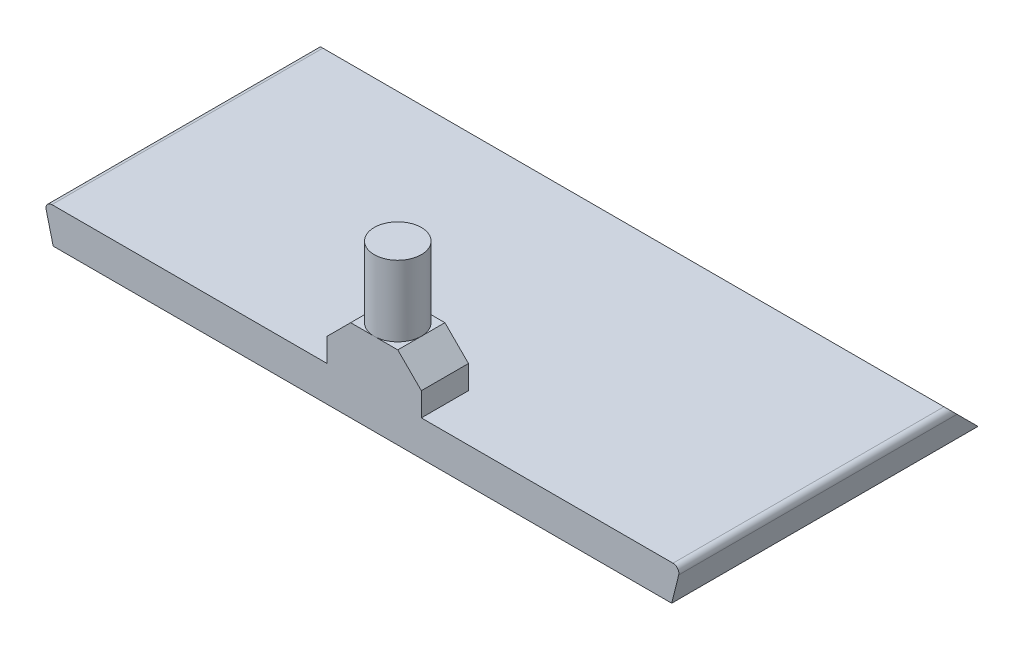
ISO-10303-21;
HEADER;
FILE_DESCRIPTION(('STEP AP214'),'2;1');
FILE_NAME('part.step','',(''),(''),'','','');
FILE_SCHEMA(('AUTOMOTIVE_DESIGN { 1 0 10303 214 1 1 1 1 }'));
ENDSEC;
DATA;
#1=APPLICATION_CONTEXT('core data for automotive mechanical design processes');
#2=APPLICATION_PROTOCOL_DEFINITION('international standard','automotive_design',2000,#1);
#3=PRODUCT_CONTEXT('',#1,'mechanical');
#4=PRODUCT('Part','Part','',(#3));
#5=PRODUCT_RELATED_PRODUCT_CATEGORY('part','',(#4));
#6=PRODUCT_DEFINITION_FORMATION('','',#4);
#7=PRODUCT_DEFINITION_CONTEXT('part definition',#1,'design');
#8=PRODUCT_DEFINITION('design','',#6,#7);
#9=PRODUCT_DEFINITION_SHAPE('','',#8);
#10=(LENGTH_UNIT() NAMED_UNIT(*) SI_UNIT(.MILLI.,.METRE.));
#11=(NAMED_UNIT(*) PLANE_ANGLE_UNIT() SI_UNIT($,.RADIAN.));
#12=(NAMED_UNIT(*) SI_UNIT($,.STERADIAN.) SOLID_ANGLE_UNIT());
#13=UNCERTAINTY_MEASURE_WITH_UNIT(LENGTH_MEASURE(1.E-05),#10,'distance_accuracy_value','');
#14=(GEOMETRIC_REPRESENTATION_CONTEXT(3) GLOBAL_UNCERTAINTY_ASSIGNED_CONTEXT((#13)) GLOBAL_UNIT_ASSIGNED_CONTEXT((#10,
#11,#12)) REPRESENTATION_CONTEXT('',''));
#15=CARTESIAN_POINT('',(0.,0.,0.));
#16=DIRECTION('',(0.,0.,1.));
#17=DIRECTION('',(1.,0.,0.));
#18=AXIS2_PLACEMENT_3D('',#15,#16,#17);
#19=CARTESIAN_POINT('',(0.,16.,0.));
#20=DIRECTION('',(0.,1.,0.));
#21=DIRECTION('',(-1.,0.,0.));
#22=AXIS2_PLACEMENT_3D('',#19,#20,#21);
#23=PLANE('',#22);
#24=DIRECTION('',(-1.,0.,0.));
#25=VECTOR('',#24,1.);
#26=CARTESIAN_POINT('',(0.,16.,33.5));
#27=LINE('',#26,#25);
#28=CARTESIAN_POINT('',(0.500000000000027,16.,33.5));
#29=VERTEX_POINT('',#28);
#30=CARTESIAN_POINT('',(-0.499999999999972,16.,33.5));
#31=VERTEX_POINT('',#30);
#32=EDGE_CURVE('E188',#29,#31,#27,.T.);
#33=ORIENTED_EDGE('',*,*,#32,.T.);
#34=DIRECTION('',(0.,0.,1.));
#35=VECTOR('',#34,1.);
#36=CARTESIAN_POINT('',(-0.499999999999972,16.,35.5));
#37=LINE('',#36,#35);
#38=CARTESIAN_POINT('',(-0.499999999999972,16.,34.5));
#39=VERTEX_POINT('',#38);
#40=EDGE_CURVE('E231',#31,#39,#37,.T.);
#41=ORIENTED_EDGE('',*,*,#40,.T.);
#42=CARTESIAN_POINT('',(0.500000000000027,16.,34.5));
#43=DIRECTION('',(0.,1.,0.));
#44=DIRECTION('',(-1.,0.,0.));
#45=AXIS2_PLACEMENT_3D('',#42,#43,#44);
#46=CIRCLE('',#45,1.);
#47=EDGE_CURVE('E185',#29,#39,#46,.T.);
#48=ORIENTED_EDGE('',*,*,#47,.F.);
#49=EDGE_LOOP('',(#33,#41,#48));
#50=FACE_BOUND('',#49,.T.);
#51=ADVANCED_FACE('F39',(#50),#23,.T.);
#52=CARTESIAN_POINT('',(0.,16.,0.));
#53=DIRECTION('',(0.,1.,0.));
#54=DIRECTION('',(-1.,0.,0.));
#55=AXIS2_PLACEMENT_3D('',#52,#53,#54);
#56=PLANE('',#55);
#57=DIRECTION('',(-1.,0.,0.));
#58=VECTOR('',#57,1.);
#59=CARTESIAN_POINT('',(0.,16.,35.5));
#60=LINE('',#59,#58);
#61=CARTESIAN_POINT('',(1.50000000000002,16.,35.5));
#62=VERTEX_POINT('',#61);
#63=CARTESIAN_POINT('',(0.500000000000027,16.,35.5));
#64=VERTEX_POINT('',#63);
#65=EDGE_CURVE('E172',#62,#64,#60,.T.);
#66=ORIENTED_EDGE('',*,*,#65,.F.);
#67=DIRECTION('',(0.,0.,-1.));
#68=VECTOR('',#67,1.);
#69=CARTESIAN_POINT('',(1.50000000000003,16.,0.));
#70=LINE('',#69,#68);
#71=CARTESIAN_POINT('',(1.50000000000002,16.,34.5));
#72=VERTEX_POINT('',#71);
#73=EDGE_CURVE('E223',#62,#72,#70,.T.);
#74=ORIENTED_EDGE('',*,*,#73,.T.);
#75=CARTESIAN_POINT('',(0.500000000000027,16.,34.5));
#76=DIRECTION('',(0.,1.,0.));
#77=DIRECTION('',(-1.,0.,0.));
#78=AXIS2_PLACEMENT_3D('',#75,#76,#77);
#79=CIRCLE('',#78,1.);
#80=EDGE_CURVE('E182',#64,#72,#79,.T.);
#81=ORIENTED_EDGE('',*,*,#80,.F.);
#82=EDGE_LOOP('',(#66,#74,#81));
#83=FACE_BOUND('',#82,.T.);
#84=ADVANCED_FACE('F288',(#83),#56,.T.);
#85=CARTESIAN_POINT('',(-13.5,14.,35.5));
#86=DIRECTION('',(0.,-1.,0.));
#87=DIRECTION('',(1.,0.,0.));
#88=AXIS2_PLACEMENT_3D('',#85,#86,#87);
#89=PLANE('',#88);
#90=DIRECTION('',(0.,0.,-1.));
#91=VECTOR('',#90,1.);
#92=CARTESIAN_POINT('',(13.1798058983989,14.,35.5));
#93=LINE('',#92,#91);
#94=CARTESIAN_POINT('',(13.1798058983989,14.,35.5));
#95=VERTEX_POINT('',#94);
#96=CARTESIAN_POINT('',(13.1798058983989,14.,24.));
#97=VERTEX_POINT('',#96);
#98=EDGE_CURVE('E238',#95,#97,#93,.T.);
#99=ORIENTED_EDGE('',*,*,#98,.T.);
#100=DIRECTION('',(-1.,0.,0.));
#101=VECTOR('',#100,1.);
#102=CARTESIAN_POINT('',(-13.5,14.,24.));
#103=LINE('',#102,#101);
#104=CARTESIAN_POINT('',(-13.1798058983989,14.,24.));
#105=VERTEX_POINT('',#104);
#106=EDGE_CURVE('E61',#97,#105,#103,.T.);
#107=ORIENTED_EDGE('',*,*,#106,.T.);
#108=DIRECTION('',(0.,0.,-1.));
#109=VECTOR('',#108,1.);
#110=CARTESIAN_POINT('',(-13.1798058983989,14.,35.5));
#111=LINE('',#110,#109);
#112=CARTESIAN_POINT('',(-13.1798058983989,14.,35.5));
#113=VERTEX_POINT('',#112);
#114=EDGE_CURVE('E240',#105,#113,#111,.F.);
#115=ORIENTED_EDGE('',*,*,#114,.T.);
#116=DIRECTION('',(-1.,0.,0.));
#117=VECTOR('',#116,1.);
#118=CARTESIAN_POINT('',(-13.5,14.,35.5));
#119=LINE('',#118,#117);
#120=CARTESIAN_POINT('',(-1.49999999999997,14.,35.5));
#121=VERTEX_POINT('',#120);
#122=EDGE_CURVE('E211',#121,#113,#119,.T.);
#123=ORIENTED_EDGE('',*,*,#122,.F.);
#124=DIRECTION('',(0.,0.,1.));
#125=VECTOR('',#124,1.);
#126=CARTESIAN_POINT('',(-1.49999999999997,14.,0.));
#127=LINE('',#126,#125);
#128=CARTESIAN_POINT('',(-1.49999999999997,14.,33.5));
#129=VERTEX_POINT('',#128);
#130=EDGE_CURVE('E198',#129,#121,#127,.T.);
#131=ORIENTED_EDGE('',*,*,#130,.F.);
#132=DIRECTION('',(-1.,0.,0.));
#133=VECTOR('',#132,1.);
#134=CARTESIAN_POINT('',(0.,14.,33.5));
#135=LINE('',#134,#133);
#136=CARTESIAN_POINT('',(2.50000000000003,14.,33.5));
#137=VERTEX_POINT('',#136);
#138=EDGE_CURVE('E178',#137,#129,#135,.T.);
#139=ORIENTED_EDGE('',*,*,#138,.F.);
#140=DIRECTION('',(0.,0.,1.));
#141=VECTOR('',#140,1.);
#142=CARTESIAN_POINT('',(2.50000000000004,14.,0.));
#143=LINE('',#142,#141);
#144=CARTESIAN_POINT('',(2.50000000000003,14.,35.5));
#145=VERTEX_POINT('',#144);
#146=EDGE_CURVE('E175',#137,#145,#143,.T.);
#147=ORIENTED_EDGE('',*,*,#146,.T.);
#148=EDGE_CURVE('E212',#95,#145,#119,.T.);
#149=ORIENTED_EDGE('',*,*,#148,.F.);
#150=EDGE_LOOP('',(#99,#107,#115,#123,#131,#139,#147,#149));
#151=FACE_BOUND('',#150,.T.);
#152=ADVANCED_FACE('F253',(#151),#89,.F.);
#153=CARTESIAN_POINT('',(0.500000000000026,19.,34.5));
#154=DIRECTION('',(0.,-1.,0.));
#155=DIRECTION('',(1.,0.,0.));
#156=AXIS2_PLACEMENT_3D('',#153,#154,#155);
#157=CYLINDRICAL_SURFACE('',#156,1.);
#158=CARTESIAN_POINT('',(0.500000000000026,19.,34.5));
#159=DIRECTION('',(0.,1.,0.));
#160=DIRECTION('',(-1.,0.,0.));
#161=AXIS2_PLACEMENT_3D('',#158,#159,#160);
#162=CIRCLE('',#161,1.);
#163=CARTESIAN_POINT('',(-0.499999999999975,19.,34.5));
#164=VERTEX_POINT('',#163);
#165=EDGE_CURVE('E204',#164,#164,#162,.T.);
#166=ORIENTED_EDGE('',*,*,#165,.F.);
#167=EDGE_LOOP('',(#166));
#168=FACE_BOUND('',#167,.T.);
#169=ORIENTED_EDGE('',*,*,#47,.T.);
#170=EDGE_CURVE('E189',#39,#64,#46,.T.);
#171=ORIENTED_EDGE('',*,*,#170,.T.);
#172=ORIENTED_EDGE('',*,*,#80,.T.);
#173=EDGE_CURVE('E164',#72,#29,#79,.T.);
#174=ORIENTED_EDGE('',*,*,#173,.T.);
#175=EDGE_LOOP('',(#169,#171,#172,#174));
#176=FACE_BOUND('',#175,.T.);
#177=ADVANCED_FACE('F303',(#168,#176),#157,.T.);
#178=CARTESIAN_POINT('',(-13.,12.,35.5));
#179=DIRECTION('',(0.970142500145331,0.242535625036335,0.));
#180=DIRECTION('',(-0.242535625036335,0.970142500145331,0.));
#181=AXIS2_PLACEMENT_3D('',#178,#179,#180);
#182=PLANE('',#181);
#183=DIRECTION('',(0.,0.,-1.));
#184=VECTOR('',#183,1.);
#185=CARTESIAN_POINT('',(-13.4223415234352,13.6893660937409,35.5));
#186=LINE('',#185,#184);
#187=CARTESIAN_POINT('',(-13.4223415234352,13.6893660937409,35.5));
#188=VERTEX_POINT('',#187);
#189=CARTESIAN_POINT('',(-13.4223415234352,13.6893660937409,23.6893660937409));
#190=VERTEX_POINT('',#189);
#191=EDGE_CURVE('E236',#188,#190,#186,.T.);
#192=ORIENTED_EDGE('',*,*,#191,.T.);
#193=DIRECTION('',(-0.174077655955699,0.69631062382279,0.696310623822793));
#194=VECTOR('',#193,1.);
#195=CARTESIAN_POINT('',(-13.1342365423757,12.5369461695029,22.5369461695029));
#196=LINE('',#195,#194);
#197=CARTESIAN_POINT('',(-13.125,12.5,22.5));
#198=VERTEX_POINT('',#197);
#199=EDGE_CURVE('E11',#190,#198,#196,.F.);
#200=ORIENTED_EDGE('',*,*,#199,.T.);
#201=DIRECTION('',(0.,0.,1.));
#202=VECTOR('',#201,1.);
#203=CARTESIAN_POINT('',(-13.125,12.5,35.5));
#204=LINE('',#203,#202);
#205=CARTESIAN_POINT('',(-13.125,12.5,35.5));
#206=VERTEX_POINT('',#205);
#207=EDGE_CURVE('E156',#198,#206,#204,.T.);
#208=ORIENTED_EDGE('',*,*,#207,.T.);
#209=DIRECTION('',(0.242535625036335,-0.970142500145331,0.));
#210=VECTOR('',#209,1.);
#211=CARTESIAN_POINT('',(-13.,12.,35.5));
#212=LINE('',#211,#210);
#213=EDGE_CURVE('E207',#188,#206,#212,.T.);
#214=ORIENTED_EDGE('',*,*,#213,.F.);
#215=EDGE_LOOP('',(#192,#200,#208,#214));
#216=FACE_BOUND('',#215,.T.);
#217=ADVANCED_FACE('F255',(#216),#182,.F.);
#218=CARTESIAN_POINT('',(0.,0.,35.5));
#219=DIRECTION('',(0.,0.,1.));
#220=DIRECTION('',(1.,0.,0.));
#221=AXIS2_PLACEMENT_3D('',#218,#219,#220);
#222=PLANE('',#221);
#223=ORIENTED_EDGE('',*,*,#122,.T.);
#224=CARTESIAN_POINT('',(-13.1798058983989,13.75,35.5));
#225=DIRECTION('',(0.,0.,1.));
#226=DIRECTION('',(1.,0.,0.));
#227=AXIS2_PLACEMENT_3D('',#224,#225,#226);
#228=CIRCLE('',#227,0.25);
#229=EDGE_CURVE('E244',#113,#188,#228,.T.);
#230=ORIENTED_EDGE('',*,*,#229,.T.);
#231=ORIENTED_EDGE('',*,*,#213,.T.);
#232=DIRECTION('',(1.,0.,0.));
#233=VECTOR('',#232,1.);
#234=CARTESIAN_POINT('',(-13.5,12.5,35.5));
#235=LINE('',#234,#233);
#236=CARTESIAN_POINT('',(13.125,12.5,35.5));
#237=VERTEX_POINT('',#236);
#238=EDGE_CURVE('E157',#206,#237,#235,.T.);
#239=ORIENTED_EDGE('',*,*,#238,.T.);
#240=DIRECTION('',(0.242535625036334,0.970142500145332,0.));
#241=VECTOR('',#240,1.);
#242=CARTESIAN_POINT('',(13.5,14.,35.5));
#243=LINE('',#242,#241);
#244=CARTESIAN_POINT('',(13.4223415234353,13.6893660937409,35.5));
#245=VERTEX_POINT('',#244);
#246=EDGE_CURVE('E162',#237,#245,#243,.T.);
#247=ORIENTED_EDGE('',*,*,#246,.T.);
#248=CARTESIAN_POINT('',(13.1798058983989,13.75,35.5));
#249=DIRECTION('',(0.,0.,1.));
#250=DIRECTION('',(1.,0.,0.));
#251=AXIS2_PLACEMENT_3D('',#248,#249,#250);
#252=CIRCLE('',#251,0.25);
#253=EDGE_CURVE('E242',#245,#95,#252,.T.);
#254=ORIENTED_EDGE('',*,*,#253,.T.);
#255=ORIENTED_EDGE('',*,*,#148,.T.);
#256=DIRECTION('',(0.,-1.,0.));
#257=VECTOR('',#256,1.);
#258=CARTESIAN_POINT('',(2.50000000000003,16.,35.5));
#259=LINE('',#258,#257);
#260=CARTESIAN_POINT('',(2.50000000000003,15.,35.5));
#261=VERTEX_POINT('',#260);
#262=EDGE_CURVE('E168',#261,#145,#259,.T.);
#263=ORIENTED_EDGE('',*,*,#262,.F.);
#264=DIRECTION('',(0.707106781186548,-0.707106781186548,0.));
#265=VECTOR('',#264,1.);
#266=CARTESIAN_POINT('',(8.75000000000001,8.75000000000001,35.5));
#267=LINE('',#266,#265);
#268=EDGE_CURVE('E219',#261,#62,#267,.F.);
#269=ORIENTED_EDGE('',*,*,#268,.T.);
#270=ORIENTED_EDGE('',*,*,#65,.T.);
#271=DIRECTION('',(-1.,0.,0.));
#272=VECTOR('',#271,1.);
#273=CARTESIAN_POINT('',(0.,16.,35.5));
#274=LINE('',#273,#272);
#275=CARTESIAN_POINT('',(-0.499999999999972,16.,35.5));
#276=VERTEX_POINT('',#275);
#277=EDGE_CURVE('E192',#64,#276,#274,.T.);
#278=ORIENTED_EDGE('',*,*,#277,.T.);
#279=DIRECTION('',(-0.707106781186546,-0.707106781186549,0.));
#280=VECTOR('',#279,1.);
#281=CARTESIAN_POINT('',(-8.24999999999999,8.24999999999996,35.5));
#282=LINE('',#281,#280);
#283=CARTESIAN_POINT('',(-1.49999999999997,15.,35.5));
#284=VERTEX_POINT('',#283);
#285=EDGE_CURVE('E217',#276,#284,#282,.T.);
#286=ORIENTED_EDGE('',*,*,#285,.T.);
#287=DIRECTION('',(0.,-1.,0.));
#288=VECTOR('',#287,1.);
#289=CARTESIAN_POINT('',(-1.49999999999997,16.,35.5));
#290=LINE('',#289,#288);
#291=EDGE_CURVE('E195',#284,#121,#290,.T.);
#292=ORIENTED_EDGE('',*,*,#291,.T.);
#293=EDGE_LOOP('',(#223,#230,#231,#239,#247,#254,#255,#263,#269,#270,#278,#286,#292));
#294=FACE_BOUND('',#293,.T.);
#295=ADVANCED_FACE('F261',(#294),#222,.T.);
#296=CARTESIAN_POINT('',(13.5,14.,35.5));
#297=DIRECTION('',(-0.970142500145332,0.242535625036334,0.));
#298=DIRECTION('',(-0.242535625036334,-0.970142500145332,0.));
#299=AXIS2_PLACEMENT_3D('',#296,#297,#298);
#300=PLANE('',#299);
#301=DIRECTION('',(0.,0.,-1.));
#302=VECTOR('',#301,1.);
#303=CARTESIAN_POINT('',(13.125,12.5,35.5));
#304=LINE('',#303,#302);
#305=CARTESIAN_POINT('',(13.125,12.5,22.5));
#306=VERTEX_POINT('',#305);
#307=EDGE_CURVE('E154',#237,#306,#304,.T.);
#308=ORIENTED_EDGE('',*,*,#307,.T.);
#309=DIRECTION('',(-0.174077655955698,-0.69631062382279,-0.696310623822793));
#310=VECTOR('',#309,1.);
#311=CARTESIAN_POINT('',(12.3203089121698,9.28123564867893,19.2812356486789));
#312=LINE('',#311,#310);
#313=CARTESIAN_POINT('',(13.4223415234353,13.6893660937409,23.6893660937409));
#314=VERTEX_POINT('',#313);
#315=EDGE_CURVE('E140',#306,#314,#312,.F.);
#316=ORIENTED_EDGE('',*,*,#315,.T.);
#317=DIRECTION('',(0.,0.,-1.));
#318=VECTOR('',#317,1.);
#319=CARTESIAN_POINT('',(13.4223415234353,13.6893660937409,35.5));
#320=LINE('',#319,#318);
#321=EDGE_CURVE('E148',#314,#245,#320,.F.);
#322=ORIENTED_EDGE('',*,*,#321,.T.);
#323=ORIENTED_EDGE('',*,*,#246,.F.);
#324=EDGE_LOOP('',(#308,#316,#322,#323));
#325=FACE_BOUND('',#324,.T.);
#326=ADVANCED_FACE('F160',(#325),#300,.F.);
#327=CARTESIAN_POINT('',(0.,19.,0.));
#328=DIRECTION('',(0.,1.,0.));
#329=DIRECTION('',(-1.,0.,0.));
#330=AXIS2_PLACEMENT_3D('',#327,#328,#329);
#331=PLANE('',#330);
#332=ORIENTED_EDGE('',*,*,#165,.T.);
#333=EDGE_LOOP('',(#332));
#334=FACE_BOUND('',#333,.T.);
#335=ADVANCED_FACE('F328',(#334),#331,.T.);
#336=CARTESIAN_POINT('',(0.,16.,33.5));
#337=DIRECTION('',(0.,0.,1.));
#338=DIRECTION('',(1.,0.,0.));
#339=AXIS2_PLACEMENT_3D('',#336,#337,#338);
#340=PLANE('',#339);
#341=DIRECTION('',(-1.,0.,0.));
#342=VECTOR('',#341,1.);
#343=CARTESIAN_POINT('',(0.,16.,33.5));
#344=LINE('',#343,#342);
#345=CARTESIAN_POINT('',(1.50000000000002,16.,33.5));
#346=VERTEX_POINT('',#345);
#347=EDGE_CURVE('E174',#346,#29,#344,.T.);
#348=ORIENTED_EDGE('',*,*,#347,.F.);
#349=DIRECTION('',(-0.707106781186548,0.707106781186548,0.));
#350=VECTOR('',#349,1.);
#351=CARTESIAN_POINT('',(2.50000000000003,15.,33.5));
#352=LINE('',#351,#350);
#353=CARTESIAN_POINT('',(2.50000000000003,15.,33.5));
#354=VERTEX_POINT('',#353);
#355=EDGE_CURVE('E227',#346,#354,#352,.F.);
#356=ORIENTED_EDGE('',*,*,#355,.T.);
#357=DIRECTION('',(0.,-1.,0.));
#358=VECTOR('',#357,1.);
#359=CARTESIAN_POINT('',(2.50000000000003,16.,33.5));
#360=LINE('',#359,#358);
#361=EDGE_CURVE('E171',#354,#137,#360,.T.);
#362=ORIENTED_EDGE('',*,*,#361,.T.);
#363=ORIENTED_EDGE('',*,*,#138,.T.);
#364=DIRECTION('',(0.,-1.,0.));
#365=VECTOR('',#364,1.);
#366=CARTESIAN_POINT('',(-1.49999999999997,16.,33.5));
#367=LINE('',#366,#365);
#368=CARTESIAN_POINT('',(-1.49999999999997,15.,33.5));
#369=VERTEX_POINT('',#368);
#370=EDGE_CURVE('E202',#369,#129,#367,.T.);
#371=ORIENTED_EDGE('',*,*,#370,.F.);
#372=DIRECTION('',(0.707106781186546,0.707106781186549,0.));
#373=VECTOR('',#372,1.);
#374=CARTESIAN_POINT('',(-0.499999999999972,16.,33.5));
#375=LINE('',#374,#373);
#376=EDGE_CURVE('E225',#369,#31,#375,.T.);
#377=ORIENTED_EDGE('',*,*,#376,.T.);
#378=ORIENTED_EDGE('',*,*,#32,.F.);
#379=EDGE_LOOP('',(#348,#356,#362,#363,#371,#377,#378));
#380=FACE_BOUND('',#379,.T.);
#381=ADVANCED_FACE('F274',(#380),#340,.F.);
#382=CARTESIAN_POINT('',(-1.49999999999997,16.,0.));
#383=DIRECTION('',(1.,0.,0.));
#384=DIRECTION('',(0.,1.,0.));
#385=AXIS2_PLACEMENT_3D('',#382,#383,#384);
#386=PLANE('',#385);
#387=ORIENTED_EDGE('',*,*,#291,.F.);
#388=DIRECTION('',(0.,0.,-1.));
#389=VECTOR('',#388,1.);
#390=CARTESIAN_POINT('',(-1.49999999999997,15.,33.5));
#391=LINE('',#390,#389);
#392=EDGE_CURVE('E234',#284,#369,#391,.T.);
#393=ORIENTED_EDGE('',*,*,#392,.T.);
#394=ORIENTED_EDGE('',*,*,#370,.T.);
#395=ORIENTED_EDGE('',*,*,#130,.T.);
#396=EDGE_LOOP('',(#387,#393,#394,#395));
#397=FACE_BOUND('',#396,.T.);
#398=ADVANCED_FACE('F268',(#397),#386,.F.);
#399=ORIENTED_EDGE('',*,*,#170,.F.);
#400=DIRECTION('',(0.,0.,1.));
#401=VECTOR('',#400,1.);
#402=CARTESIAN_POINT('',(-0.499999999999972,16.,35.5));
#403=LINE('',#402,#401);
#404=EDGE_CURVE('E229',#39,#276,#403,.T.);
#405=ORIENTED_EDGE('',*,*,#404,.T.);
#406=ORIENTED_EDGE('',*,*,#277,.F.);
#407=EDGE_LOOP('',(#399,#405,#406));
#408=FACE_BOUND('',#407,.T.);
#409=ADVANCED_FACE('F295',(#408),#23,.T.);
#410=CARTESIAN_POINT('',(2.50000000000003,16.,0.));
#411=DIRECTION('',(1.,0.,0.));
#412=DIRECTION('',(0.,1.,0.));
#413=AXIS2_PLACEMENT_3D('',#410,#411,#412);
#414=PLANE('',#413);
#415=ORIENTED_EDGE('',*,*,#361,.F.);
#416=DIRECTION('',(0.,0.,1.));
#417=VECTOR('',#416,1.);
#418=CARTESIAN_POINT('',(2.50000000000004,15.,0.));
#419=LINE('',#418,#417);
#420=EDGE_CURVE('E214',#354,#261,#419,.T.);
#421=ORIENTED_EDGE('',*,*,#420,.T.);
#422=ORIENTED_EDGE('',*,*,#262,.T.);
#423=ORIENTED_EDGE('',*,*,#146,.F.);
#424=EDGE_LOOP('',(#415,#421,#422,#423));
#425=FACE_BOUND('',#424,.T.);
#426=ADVANCED_FACE('F279',(#425),#414,.T.);
#427=ORIENTED_EDGE('',*,*,#173,.F.);
#428=DIRECTION('',(0.,0.,-1.));
#429=VECTOR('',#428,1.);
#430=CARTESIAN_POINT('',(1.50000000000003,16.,0.));
#431=LINE('',#430,#429);
#432=EDGE_CURVE('E221',#72,#346,#431,.T.);
#433=ORIENTED_EDGE('',*,*,#432,.T.);
#434=ORIENTED_EDGE('',*,*,#347,.T.);
#435=EDGE_LOOP('',(#427,#433,#434));
#436=FACE_BOUND('',#435,.T.);
#437=ADVANCED_FACE('F305',(#436),#56,.T.);
#438=CARTESIAN_POINT('',(2.50000000000004,15.,0.));
#439=DIRECTION('',(-0.707106781186547,-0.707106781186547,0.));
#440=DIRECTION('',(0.,0.,1.));
#441=AXIS2_PLACEMENT_3D('',#438,#439,#440);
#442=PLANE('',#441);
#443=ORIENTED_EDGE('',*,*,#432,.F.);
#444=ORIENTED_EDGE('',*,*,#73,.F.);
#445=ORIENTED_EDGE('',*,*,#268,.F.);
#446=ORIENTED_EDGE('',*,*,#420,.F.);
#447=ORIENTED_EDGE('',*,*,#355,.F.);
#448=EDGE_LOOP('',(#443,#444,#445,#446,#447));
#449=FACE_BOUND('',#448,.T.);
#450=ADVANCED_FACE('F283',(#449),#442,.F.);
#451=CARTESIAN_POINT('',(-0.499999999999972,16.,0.));
#452=DIRECTION('',(-0.707106781186549,0.707106781186546,0.));
#453=DIRECTION('',(0.,0.,-1.));
#454=AXIS2_PLACEMENT_3D('',#451,#452,#453);
#455=PLANE('',#454);
#456=ORIENTED_EDGE('',*,*,#376,.F.);
#457=ORIENTED_EDGE('',*,*,#392,.F.);
#458=ORIENTED_EDGE('',*,*,#285,.F.);
#459=ORIENTED_EDGE('',*,*,#404,.F.);
#460=ORIENTED_EDGE('',*,*,#40,.F.);
#461=EDGE_LOOP('',(#456,#457,#458,#459,#460));
#462=FACE_BOUND('',#461,.T.);
#463=ADVANCED_FACE('F298',(#462),#455,.T.);
#464=CARTESIAN_POINT('',(-13.5,12.5,35.5));
#465=DIRECTION('',(0.,1.,0.));
#466=DIRECTION('',(0.,0.,1.));
#467=AXIS2_PLACEMENT_3D('',#464,#465,#466);
#468=PLANE('',#467);
#469=ORIENTED_EDGE('',*,*,#207,.F.);
#470=DIRECTION('',(1.,0.,0.));
#471=VECTOR('',#470,1.);
#472=CARTESIAN_POINT('',(-13.5,12.5,22.5));
#473=LINE('',#472,#471);
#474=EDGE_CURVE('E143',#198,#306,#473,.T.);
#475=ORIENTED_EDGE('',*,*,#474,.T.);
#476=ORIENTED_EDGE('',*,*,#307,.F.);
#477=ORIENTED_EDGE('',*,*,#238,.F.);
#478=EDGE_LOOP('',(#469,#475,#476,#477));
#479=FACE_BOUND('',#478,.T.);
#480=ADVANCED_FACE('F152',(#479),#468,.F.);
#481=CARTESIAN_POINT('',(-13.1798058983989,13.75,35.5));
#482=DIRECTION('',(0.,0.,-1.));
#483=DIRECTION('',(-1.,0.,0.));
#484=AXIS2_PLACEMENT_3D('',#481,#482,#483);
#485=CYLINDRICAL_SURFACE('',#484,0.25);
#486=ORIENTED_EDGE('',*,*,#114,.F.);
#487=CARTESIAN_POINT('',(-13.1798058983989,13.75,23.75));
#488=DIRECTION('',(0.,-0.707106781186549,0.707106781186546));
#489=DIRECTION('',(0.,-0.707106781186546,-0.707106781186549));
#490=AXIS2_PLACEMENT_3D('',#487,#488,#489);
#491=ELLIPSE('',#490,0.353553390593275,0.25);
#492=EDGE_CURVE('E47',#105,#190,#491,.T.);
#493=ORIENTED_EDGE('',*,*,#492,.T.);
#494=ORIENTED_EDGE('',*,*,#191,.F.);
#495=ORIENTED_EDGE('',*,*,#229,.F.);
#496=EDGE_LOOP('',(#486,#493,#494,#495));
#497=FACE_BOUND('',#496,.T.);
#498=ADVANCED_FACE('F258',(#497),#485,.T.);
#499=CARTESIAN_POINT('',(13.1798058983989,13.75,35.5));
#500=DIRECTION('',(0.,0.,-1.));
#501=DIRECTION('',(-1.,0.,0.));
#502=AXIS2_PLACEMENT_3D('',#499,#500,#501);
#503=CYLINDRICAL_SURFACE('',#502,0.25);
#504=ORIENTED_EDGE('',*,*,#321,.F.);
#505=CARTESIAN_POINT('',(13.1798058983989,13.75,23.75));
#506=DIRECTION('',(0.,-0.707106781186549,0.707106781186546));
#507=DIRECTION('',(0.,-0.707106781186546,-0.707106781186549));
#508=AXIS2_PLACEMENT_3D('',#505,#506,#507);
#509=ELLIPSE('',#508,0.353553390593275,0.25);
#510=EDGE_CURVE('E144',#314,#97,#509,.T.);
#511=ORIENTED_EDGE('',*,*,#510,.T.);
#512=ORIENTED_EDGE('',*,*,#98,.F.);
#513=ORIENTED_EDGE('',*,*,#253,.F.);
#514=EDGE_LOOP('',(#504,#511,#512,#513));
#515=FACE_BOUND('',#514,.T.);
#516=ADVANCED_FACE('F250',(#515),#503,.T.);
#517=CARTESIAN_POINT('',(-13.4298058983989,12.5,22.5));
#518=DIRECTION('',(0.,-0.707106781186549,0.707106781186546));
#519=DIRECTION('',(1.,0.,0.));
#520=AXIS2_PLACEMENT_3D('',#517,#518,#519);
#521=PLANE('',#520);
#522=ORIENTED_EDGE('',*,*,#492,.F.);
#523=ORIENTED_EDGE('',*,*,#106,.F.);
#524=ORIENTED_EDGE('',*,*,#510,.F.);
#525=ORIENTED_EDGE('',*,*,#315,.F.);
#526=ORIENTED_EDGE('',*,*,#474,.F.);
#527=ORIENTED_EDGE('',*,*,#199,.F.);
#528=EDGE_LOOP('',(#522,#523,#524,#525,#526,#527));
#529=FACE_BOUND('',#528,.T.);
#530=ADVANCED_FACE('F41',(#529),#521,.F.);
#531=CLOSED_SHELL('',(#51,#84,#152,#177,#217,#295,#326,#335,#381,#398,#409,#426,#437,#450,#463,
#480,#498,#516,#530));
#532=MANIFOLD_SOLID_BREP('B2',#531);
#533=ADVANCED_BREP_SHAPE_REPRESENTATION('',(#18,#532),#14);
#534=SHAPE_DEFINITION_REPRESENTATION(#9,#533);
ENDSEC;
END-ISO-10303-21;
